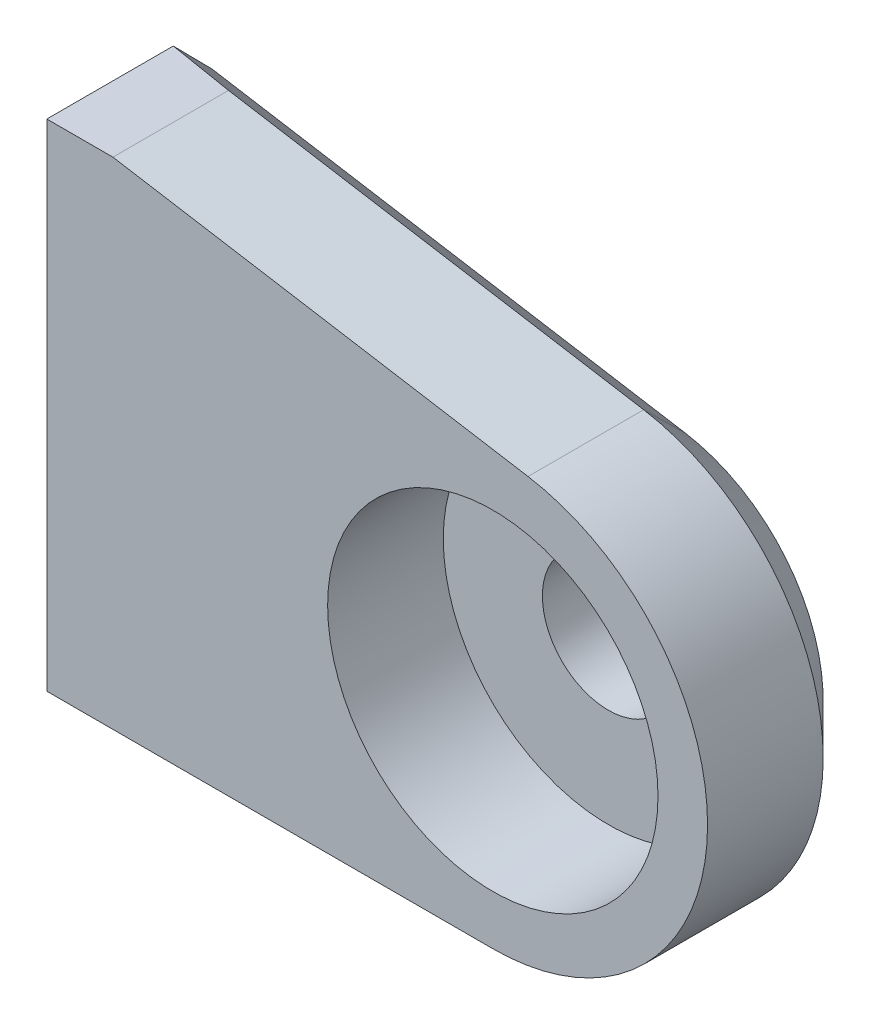
ISO-10303-21;
HEADER;
FILE_DESCRIPTION(('STEP AP214'),'2;1');
FILE_NAME('part.step','',(''),(''),'','','');
FILE_SCHEMA(('AUTOMOTIVE_DESIGN { 1 0 10303 214 1 1 1 1 }'));
ENDSEC;
DATA;
#1=APPLICATION_CONTEXT('core data for automotive mechanical design processes');
#2=APPLICATION_PROTOCOL_DEFINITION('international standard','automotive_design',2000,#1);
#3=PRODUCT_CONTEXT('',#1,'mechanical');
#4=PRODUCT('Part','Part','',(#3));
#5=PRODUCT_RELATED_PRODUCT_CATEGORY('part','',(#4));
#6=PRODUCT_DEFINITION_FORMATION('','',#4);
#7=PRODUCT_DEFINITION_CONTEXT('part definition',#1,'design');
#8=PRODUCT_DEFINITION('design','',#6,#7);
#9=PRODUCT_DEFINITION_SHAPE('','',#8);
#10=(LENGTH_UNIT() NAMED_UNIT(*) SI_UNIT(.MILLI.,.METRE.));
#11=(NAMED_UNIT(*) PLANE_ANGLE_UNIT() SI_UNIT($,.RADIAN.));
#12=(NAMED_UNIT(*) SI_UNIT($,.STERADIAN.) SOLID_ANGLE_UNIT());
#13=UNCERTAINTY_MEASURE_WITH_UNIT(LENGTH_MEASURE(1.E-05),#10,'distance_accuracy_value','');
#14=(GEOMETRIC_REPRESENTATION_CONTEXT(3) GLOBAL_UNCERTAINTY_ASSIGNED_CONTEXT((#13)) GLOBAL_UNIT_ASSIGNED_CONTEXT((#10,
#11,#12)) REPRESENTATION_CONTEXT('',''));
#15=CARTESIAN_POINT('',(0.,0.,0.));
#16=DIRECTION('',(0.,0.,1.));
#17=DIRECTION('',(1.,0.,0.));
#18=AXIS2_PLACEMENT_3D('',#15,#16,#17);
#19=CARTESIAN_POINT('',(0.,0.,5.));
#20=DIRECTION('',(0.,0.,-1.));
#21=DIRECTION('',(-1.,0.,0.));
#22=AXIS2_PLACEMENT_3D('',#19,#20,#21);
#23=CYLINDRICAL_SURFACE('',#22,2.);
#24=CARTESIAN_POINT('',(0.,0.,0.));
#25=DIRECTION('',(0.,0.,1.));
#26=DIRECTION('',(1.,0.,0.));
#27=AXIS2_PLACEMENT_3D('',#24,#25,#26);
#28=CIRCLE('',#27,2.);
#29=CARTESIAN_POINT('',(2.,0.,0.));
#30=VERTEX_POINT('',#29);
#31=EDGE_CURVE('E128',#30,#30,#28,.T.);
#32=ORIENTED_EDGE('',*,*,#31,.F.);
#33=EDGE_LOOP('',(#32));
#34=FACE_BOUND('',#33,.T.);
#35=CARTESIAN_POINT('',(0.,0.,1.5));
#36=DIRECTION('',(0.,0.,1.));
#37=DIRECTION('',(1.,0.,0.));
#38=AXIS2_PLACEMENT_3D('',#35,#36,#37);
#39=CIRCLE('',#38,2.);
#40=CARTESIAN_POINT('',(2.,0.,1.5));
#41=VERTEX_POINT('',#40);
#42=EDGE_CURVE('E126',#41,#41,#39,.T.);
#43=ORIENTED_EDGE('',*,*,#42,.T.);
#44=EDGE_LOOP('',(#43));
#45=FACE_BOUND('',#44,.T.);
#46=ADVANCED_FACE('F33',(#34,#45),#23,.F.);
#47=CARTESIAN_POINT('',(0.,0.,5.));
#48=DIRECTION('',(0.,0.,1.));
#49=DIRECTION('',(1.,0.,0.));
#50=AXIS2_PLACEMENT_3D('',#47,#48,#49);
#51=PLANE('',#50);
#52=CARTESIAN_POINT('',(0.,0.,5.));
#53=DIRECTION('',(0.,0.,1.));
#54=DIRECTION('',(1.,0.,0.));
#55=AXIS2_PLACEMENT_3D('',#52,#53,#54);
#56=CIRCLE('',#55,5.);
#57=CARTESIAN_POINT('',(5.,0.,5.));
#58=VERTEX_POINT('',#57);
#59=EDGE_CURVE('E161',#58,#58,#56,.T.);
#60=ORIENTED_EDGE('',*,*,#59,.F.);
#61=EDGE_LOOP('',(#60));
#62=FACE_BOUND('',#61,.T.);
#63=CARTESIAN_POINT('',(0.,0.,5.));
#64=DIRECTION('',(0.,0.,1.));
#65=DIRECTION('',(1.,0.,0.));
#66=AXIS2_PLACEMENT_3D('',#63,#64,#65);
#67=CIRCLE('',#66,6.5);
#68=CARTESIAN_POINT('',(0.,-6.5,5.));
#69=VERTEX_POINT('',#68);
#70=CARTESIAN_POINT('',(1.06545276752004,6.41208315605653,5.));
#71=VERTEX_POINT('',#70);
#72=EDGE_CURVE('E107',#69,#71,#67,.T.);
#73=ORIENTED_EDGE('',*,*,#72,.T.);
#74=DIRECTION('',(-0.986474331701005,0.163915810387699,0.));
#75=VECTOR('',#74,1.);
#76=CARTESIAN_POINT('',(-11.5,8.5,5.));
#77=LINE('',#76,#75);
#78=CARTESIAN_POINT('',(-11.5,8.5,5.));
#79=VERTEX_POINT('',#78);
#80=EDGE_CURVE('E95',#71,#79,#77,.T.);
#81=ORIENTED_EDGE('',*,*,#80,.T.);
#82=DIRECTION('',(-1.,0.,0.));
#83=VECTOR('',#82,1.);
#84=CARTESIAN_POINT('',(-13.5,8.5,5.));
#85=LINE('',#84,#83);
#86=CARTESIAN_POINT('',(-13.5,8.5,5.));
#87=VERTEX_POINT('',#86);
#88=EDGE_CURVE('E106',#79,#87,#85,.T.);
#89=ORIENTED_EDGE('',*,*,#88,.T.);
#90=DIRECTION('',(0.,-1.,0.));
#91=VECTOR('',#90,1.);
#92=CARTESIAN_POINT('',(-13.5,-6.5,5.));
#93=LINE('',#92,#91);
#94=CARTESIAN_POINT('',(-13.5,-6.5,5.));
#95=VERTEX_POINT('',#94);
#96=EDGE_CURVE('E171',#87,#95,#93,.T.);
#97=ORIENTED_EDGE('',*,*,#96,.T.);
#98=DIRECTION('',(1.,0.,0.));
#99=VECTOR('',#98,1.);
#100=CARTESIAN_POINT('',(0.,-6.5,5.));
#101=LINE('',#100,#99);
#102=EDGE_CURVE('E112',#95,#69,#101,.T.);
#103=ORIENTED_EDGE('',*,*,#102,.T.);
#104=EDGE_LOOP('',(#73,#81,#89,#97,#103));
#105=FACE_BOUND('',#104,.T.);
#106=ADVANCED_FACE('F110',(#62,#105),#51,.T.);
#107=CARTESIAN_POINT('',(0.,0.,0.));
#108=DIRECTION('',(0.,0.,1.));
#109=DIRECTION('',(1.,0.,0.));
#110=AXIS2_PLACEMENT_3D('',#107,#108,#109);
#111=PLANE('',#110);
#112=DIRECTION('',(0.,-1.,0.));
#113=VECTOR('',#112,1.);
#114=CARTESIAN_POINT('',(-13.5,-6.5,0.));
#115=LINE('',#114,#113);
#116=CARTESIAN_POINT('',(-13.5,7.31175987903972,0.));
#117=VERTEX_POINT('',#116);
#118=CARTESIAN_POINT('',(-13.5,-5.,0.));
#119=VERTEX_POINT('',#118);
#120=EDGE_CURVE('E114',#117,#119,#115,.T.);
#121=ORIENTED_EDGE('',*,*,#120,.F.);
#122=DIRECTION('',(0.986474331701005,-0.163915810387699,0.));
#123=VECTOR('',#122,1.);
#124=CARTESIAN_POINT('',(0.819579051938495,4.93237165850501,0.));
#125=LINE('',#124,#123);
#126=CARTESIAN_POINT('',(0.819579051938494,4.93237165850502,0.));
#127=VERTEX_POINT('',#126);
#128=EDGE_CURVE('E56',#117,#127,#125,.T.);
#129=ORIENTED_EDGE('',*,*,#128,.T.);
#130=CARTESIAN_POINT('',(0.,0.,0.));
#131=DIRECTION('',(0.,0.,1.));
#132=DIRECTION('',(1.,0.,0.));
#133=AXIS2_PLACEMENT_3D('',#130,#131,#132);
#134=CIRCLE('',#133,4.99999999999999);
#135=CARTESIAN_POINT('',(0.,-4.99999999999999,0.));
#136=VERTEX_POINT('',#135);
#137=EDGE_CURVE('E138',#127,#136,#134,.F.);
#138=ORIENTED_EDGE('',*,*,#137,.T.);
#139=DIRECTION('',(-1.,0.,0.));
#140=VECTOR('',#139,1.);
#141=CARTESIAN_POINT('',(0.,-4.99999999999999,0.));
#142=LINE('',#141,#140);
#143=EDGE_CURVE('E136',#136,#119,#142,.T.);
#144=ORIENTED_EDGE('',*,*,#143,.T.);
#145=EDGE_LOOP('',(#121,#129,#138,#144));
#146=FACE_BOUND('',#145,.T.);
#147=ORIENTED_EDGE('',*,*,#31,.T.);
#148=EDGE_LOOP('',(#147));
#149=FACE_BOUND('',#148,.T.);
#150=ADVANCED_FACE('F194',(#146,#149),#111,.F.);
#151=CARTESIAN_POINT('',(0.,0.,5.));
#152=DIRECTION('',(0.,0.,-1.));
#153=DIRECTION('',(-1.,0.,0.));
#154=AXIS2_PLACEMENT_3D('',#151,#152,#153);
#155=CYLINDRICAL_SURFACE('',#154,6.5);
#156=DIRECTION('',(0.,0.,-1.));
#157=VECTOR('',#156,1.);
#158=CARTESIAN_POINT('',(0.,-6.5,5.));
#159=LINE('',#158,#157);
#160=CARTESIAN_POINT('',(0.,-6.5,1.5));
#161=VERTEX_POINT('',#160);
#162=EDGE_CURVE('E174',#69,#161,#159,.T.);
#163=ORIENTED_EDGE('',*,*,#162,.T.);
#164=CARTESIAN_POINT('',(0.,0.,1.5));
#165=DIRECTION('',(0.,0.,1.));
#166=DIRECTION('',(1.,0.,0.));
#167=AXIS2_PLACEMENT_3D('',#164,#165,#166);
#168=CIRCLE('',#167,6.5);
#169=CARTESIAN_POINT('',(1.06545276752004,6.41208315605653,1.5));
#170=VERTEX_POINT('',#169);
#171=EDGE_CURVE('E42',#161,#170,#168,.T.);
#172=ORIENTED_EDGE('',*,*,#171,.T.);
#173=DIRECTION('',(0.,0.,-1.));
#174=VECTOR('',#173,1.);
#175=CARTESIAN_POINT('',(1.06545276752004,6.41208315605653,5.));
#176=LINE('',#175,#174);
#177=EDGE_CURVE('E100',#71,#170,#176,.T.);
#178=ORIENTED_EDGE('',*,*,#177,.F.);
#179=ORIENTED_EDGE('',*,*,#72,.F.);
#180=EDGE_LOOP('',(#163,#172,#178,#179));
#181=FACE_BOUND('',#180,.T.);
#182=ADVANCED_FACE('F116',(#181),#155,.T.);
#183=CARTESIAN_POINT('',(-11.5,8.5,5.));
#184=DIRECTION('',(-0.163915810387699,-0.986474331701005,0.));
#185=DIRECTION('',(0.986474331701005,-0.163915810387699,0.));
#186=AXIS2_PLACEMENT_3D('',#183,#184,#185);
#187=PLANE('',#186);
#188=ORIENTED_EDGE('',*,*,#177,.T.);
#189=DIRECTION('',(-0.986474331701005,0.163915810387699,0.));
#190=VECTOR('',#189,1.);
#191=CARTESIAN_POINT('',(-11.5,8.5,1.5));
#192=LINE('',#191,#190);
#193=CARTESIAN_POINT('',(-11.5,8.5,1.5));
#194=VERTEX_POINT('',#193);
#195=EDGE_CURVE('E118',#170,#194,#192,.T.);
#196=ORIENTED_EDGE('',*,*,#195,.T.);
#197=DIRECTION('',(0.,0.,-1.));
#198=VECTOR('',#197,1.);
#199=CARTESIAN_POINT('',(-11.5,8.5,5.));
#200=LINE('',#199,#198);
#201=EDGE_CURVE('E103',#79,#194,#200,.T.);
#202=ORIENTED_EDGE('',*,*,#201,.F.);
#203=ORIENTED_EDGE('',*,*,#80,.F.);
#204=EDGE_LOOP('',(#188,#196,#202,#203));
#205=FACE_BOUND('',#204,.T.);
#206=ADVANCED_FACE('F97',(#205),#187,.F.);
#207=CARTESIAN_POINT('',(-13.5,8.5,5.));
#208=DIRECTION('',(0.,-1.,0.));
#209=DIRECTION('',(0.,0.,-1.));
#210=AXIS2_PLACEMENT_3D('',#207,#208,#209);
#211=PLANE('',#210);
#212=ORIENTED_EDGE('',*,*,#201,.T.);
#213=DIRECTION('',(0.986830597713906,0.,0.161757137139652));
#214=VECTOR('',#213,1.);
#215=CARTESIAN_POINT('',(-11.5,8.5,1.5));
#216=LINE('',#215,#214);
#217=CARTESIAN_POINT('',(-13.5,8.5,1.1721683792246));
#218=VERTEX_POINT('',#217);
#219=EDGE_CURVE('E120',#194,#218,#216,.F.);
#220=ORIENTED_EDGE('',*,*,#219,.T.);
#221=DIRECTION('',(0.,0.,-1.));
#222=VECTOR('',#221,1.);
#223=CARTESIAN_POINT('',(-13.5,8.5,5.));
#224=LINE('',#223,#222);
#225=EDGE_CURVE('E122',#87,#218,#224,.T.);
#226=ORIENTED_EDGE('',*,*,#225,.F.);
#227=ORIENTED_EDGE('',*,*,#88,.F.);
#228=EDGE_LOOP('',(#212,#220,#226,#227));
#229=FACE_BOUND('',#228,.T.);
#230=ADVANCED_FACE('F188',(#229),#211,.F.);
#231=CARTESIAN_POINT('',(-13.5,-6.5,5.));
#232=DIRECTION('',(1.,0.,0.));
#233=DIRECTION('',(0.,1.,0.));
#234=AXIS2_PLACEMENT_3D('',#231,#232,#233);
#235=PLANE('',#234);
#236=CARTESIAN_POINT('',(-13.5,-4.,2.5));
#237=DIRECTION('',(-1.,0.,0.));
#238=DIRECTION('',(0.,1.,0.));
#239=AXIS2_PLACEMENT_3D('',#236,#237,#238);
#240=CIRCLE('',#239,1.);
#241=CARTESIAN_POINT('',(-13.5,-3.,2.5));
#242=VERTEX_POINT('',#241);
#243=EDGE_CURVE('E146',#242,#242,#240,.T.);
#244=ORIENTED_EDGE('',*,*,#243,.F.);
#245=EDGE_LOOP('',(#244));
#246=FACE_BOUND('',#245,.T.);
#247=CARTESIAN_POINT('',(-13.5,6.,2.5));
#248=DIRECTION('',(-1.,0.,0.));
#249=DIRECTION('',(0.,-1.,0.));
#250=AXIS2_PLACEMENT_3D('',#247,#248,#249);
#251=CIRCLE('',#250,1.);
#252=CARTESIAN_POINT('',(-13.5,5.,2.5));
#253=VERTEX_POINT('',#252);
#254=EDGE_CURVE('E155',#253,#253,#251,.T.);
#255=ORIENTED_EDGE('',*,*,#254,.F.);
#256=EDGE_LOOP('',(#255));
#257=FACE_BOUND('',#256,.T.);
#258=ORIENTED_EDGE('',*,*,#225,.T.);
#259=DIRECTION('',(0.,0.711904885384779,0.702275896044627));
#260=VECTOR('',#259,1.);
#261=CARTESIAN_POINT('',(-13.5,8.66390061253408,1.33385212643955));
#262=LINE('',#261,#260);
#263=EDGE_CURVE('E134',#218,#117,#262,.F.);
#264=ORIENTED_EDGE('',*,*,#263,.T.);
#265=ORIENTED_EDGE('',*,*,#120,.T.);
#266=DIRECTION('',(0.,0.707106781186549,-0.707106781186546));
#267=VECTOR('',#266,1.);
#268=CARTESIAN_POINT('',(-13.5,-6.5,1.5));
#269=LINE('',#268,#267);
#270=CARTESIAN_POINT('',(-13.5,-6.5,1.5));
#271=VERTEX_POINT('',#270);
#272=EDGE_CURVE('E132',#119,#271,#269,.F.);
#273=ORIENTED_EDGE('',*,*,#272,.T.);
#274=DIRECTION('',(0.,0.,-1.));
#275=VECTOR('',#274,1.);
#276=CARTESIAN_POINT('',(-13.5,-6.5,5.));
#277=LINE('',#276,#275);
#278=EDGE_CURVE('E178',#95,#271,#277,.T.);
#279=ORIENTED_EDGE('',*,*,#278,.F.);
#280=ORIENTED_EDGE('',*,*,#96,.F.);
#281=EDGE_LOOP('',(#258,#264,#265,#273,#279,#280));
#282=FACE_BOUND('',#281,.T.);
#283=ADVANCED_FACE('F184',(#246,#257,#282),#235,.F.);
#284=CARTESIAN_POINT('',(0.,-6.5,5.));
#285=DIRECTION('',(0.,1.,0.));
#286=DIRECTION('',(-1.,0.,0.));
#287=AXIS2_PLACEMENT_3D('',#284,#285,#286);
#288=PLANE('',#287);
#289=ORIENTED_EDGE('',*,*,#278,.T.);
#290=DIRECTION('',(1.,0.,0.));
#291=VECTOR('',#290,1.);
#292=CARTESIAN_POINT('',(0.,-6.5,1.5));
#293=LINE('',#292,#291);
#294=EDGE_CURVE('E11',#271,#161,#293,.T.);
#295=ORIENTED_EDGE('',*,*,#294,.T.);
#296=ORIENTED_EDGE('',*,*,#162,.F.);
#297=ORIENTED_EDGE('',*,*,#102,.F.);
#298=EDGE_LOOP('',(#289,#295,#296,#297));
#299=FACE_BOUND('',#298,.T.);
#300=ADVANCED_FACE('F190',(#299),#288,.F.);
#301=CARTESIAN_POINT('',(0.,0.,1.5));
#302=DIRECTION('',(0.,0.,1.));
#303=DIRECTION('',(1.,0.,0.));
#304=AXIS2_PLACEMENT_3D('',#301,#302,#303);
#305=CYLINDRICAL_SURFACE('',#304,5.);
#306=CARTESIAN_POINT('',(0.,0.,1.5));
#307=DIRECTION('',(0.,0.,1.));
#308=DIRECTION('',(1.,0.,0.));
#309=AXIS2_PLACEMENT_3D('',#306,#307,#308);
#310=CIRCLE('',#309,5.);
#311=CARTESIAN_POINT('',(5.,0.,1.5));
#312=VERTEX_POINT('',#311);
#313=EDGE_CURVE('E129',#312,#312,#310,.T.);
#314=ORIENTED_EDGE('',*,*,#313,.F.);
#315=EDGE_LOOP('',(#314));
#316=FACE_BOUND('',#315,.T.);
#317=ORIENTED_EDGE('',*,*,#59,.T.);
#318=EDGE_LOOP('',(#317));
#319=FACE_BOUND('',#318,.T.);
#320=ADVANCED_FACE('F209',(#316,#319),#305,.F.);
#321=CARTESIAN_POINT('',(0.,0.,1.5));
#322=DIRECTION('',(0.,0.,1.));
#323=DIRECTION('',(1.,0.,0.));
#324=AXIS2_PLACEMENT_3D('',#321,#322,#323);
#325=PLANE('',#324);
#326=ORIENTED_EDGE('',*,*,#42,.F.);
#327=EDGE_LOOP('',(#326));
#328=FACE_BOUND('',#327,.T.);
#329=ORIENTED_EDGE('',*,*,#313,.T.);
#330=EDGE_LOOP('',(#329));
#331=FACE_BOUND('',#330,.T.);
#332=ADVANCED_FACE('F205',(#328,#331),#325,.T.);
#333=CARTESIAN_POINT('',(-11.5,6.,2.5));
#334=DIRECTION('',(-1.,0.,0.));
#335=DIRECTION('',(0.,-1.,0.));
#336=AXIS2_PLACEMENT_3D('',#333,#334,#335);
#337=CYLINDRICAL_SURFACE('',#336,1.);
#338=CARTESIAN_POINT('',(-11.5,6.,2.5));
#339=DIRECTION('',(-1.,0.,0.));
#340=DIRECTION('',(0.,-1.,0.));
#341=AXIS2_PLACEMENT_3D('',#338,#339,#340);
#342=CIRCLE('',#341,1.);
#343=CARTESIAN_POINT('',(-11.5,5.,2.5));
#344=VERTEX_POINT('',#343);
#345=EDGE_CURVE('E158',#344,#344,#342,.T.);
#346=ORIENTED_EDGE('',*,*,#345,.F.);
#347=EDGE_LOOP('',(#346));
#348=FACE_BOUND('',#347,.T.);
#349=ORIENTED_EDGE('',*,*,#254,.T.);
#350=EDGE_LOOP('',(#349));
#351=FACE_BOUND('',#350,.T.);
#352=ADVANCED_FACE('F208',(#348,#351),#337,.F.);
#353=CARTESIAN_POINT('',(-11.5,6.,2.5));
#354=DIRECTION('',(-1.,0.,0.));
#355=DIRECTION('',(0.,-1.,0.));
#356=AXIS2_PLACEMENT_3D('',#353,#354,#355);
#357=PLANE('',#356);
#358=ORIENTED_EDGE('',*,*,#345,.T.);
#359=EDGE_LOOP('',(#358));
#360=FACE_BOUND('',#359,.T.);
#361=ADVANCED_FACE('F249',(#360),#357,.T.);
#362=CARTESIAN_POINT('',(-11.5,-4.,2.5));
#363=DIRECTION('',(-1.,0.,0.));
#364=DIRECTION('',(0.,-1.,0.));
#365=AXIS2_PLACEMENT_3D('',#362,#363,#364);
#366=CYLINDRICAL_SURFACE('',#365,1.);
#367=CARTESIAN_POINT('',(-11.5,-4.,2.5));
#368=DIRECTION('',(-1.,0.,0.));
#369=DIRECTION('',(0.,1.,0.));
#370=AXIS2_PLACEMENT_3D('',#367,#368,#369);
#371=CIRCLE('',#370,1.);
#372=CARTESIAN_POINT('',(-11.5,-3.,2.5));
#373=VERTEX_POINT('',#372);
#374=EDGE_CURVE('E150',#373,#373,#371,.T.);
#375=ORIENTED_EDGE('',*,*,#374,.F.);
#376=EDGE_LOOP('',(#375));
#377=FACE_BOUND('',#376,.T.);
#378=ORIENTED_EDGE('',*,*,#243,.T.);
#379=EDGE_LOOP('',(#378));
#380=FACE_BOUND('',#379,.T.);
#381=ADVANCED_FACE('F243',(#377,#380),#366,.F.);
#382=CARTESIAN_POINT('',(-11.5,-4.,2.5));
#383=DIRECTION('',(1.,0.,0.));
#384=DIRECTION('',(0.,1.,0.));
#385=AXIS2_PLACEMENT_3D('',#382,#383,#384);
#386=PLANE('',#385);
#387=ORIENTED_EDGE('',*,*,#374,.T.);
#388=EDGE_LOOP('',(#387));
#389=FACE_BOUND('',#388,.T.);
#390=ADVANCED_FACE('F239',(#389),#386,.F.);
#391=CARTESIAN_POINT('',(0.,-6.5,1.5));
#392=DIRECTION('',(0.,0.707106781186546,0.707106781186549));
#393=DIRECTION('',(0.,-0.707106781186549,0.707106781186546));
#394=AXIS2_PLACEMENT_3D('',#391,#392,#393);
#395=PLANE('',#394);
#396=ORIENTED_EDGE('',*,*,#272,.F.);
#397=ORIENTED_EDGE('',*,*,#143,.F.);
#398=DIRECTION('',(0.,0.707106781186549,-0.707106781186546));
#399=VECTOR('',#398,1.);
#400=CARTESIAN_POINT('',(0.,-6.5,1.5));
#401=LINE('',#400,#399);
#402=EDGE_CURVE('E37',#161,#136,#401,.T.);
#403=ORIENTED_EDGE('',*,*,#402,.F.);
#404=ORIENTED_EDGE('',*,*,#294,.F.);
#405=EDGE_LOOP('',(#396,#397,#403,#404));
#406=FACE_BOUND('',#405,.T.);
#407=ADVANCED_FACE('F35',(#406),#395,.F.);
#408=CARTESIAN_POINT('',(0.,0.,1.5));
#409=DIRECTION('',(0.,0.,1.));
#410=DIRECTION('',(1.,0.,0.));
#411=AXIS2_PLACEMENT_3D('',#408,#409,#410);
#412=CONICAL_SURFACE('',#411,6.5,0.785398163397451);
#413=ORIENTED_EDGE('',*,*,#402,.T.);
#414=ORIENTED_EDGE('',*,*,#137,.F.);
#415=DIRECTION('',(-0.115905981068831,-0.69754268941225,-0.707106781186546));
#416=VECTOR('',#415,1.);
#417=CARTESIAN_POINT('',(1.06545276752004,6.41208315605653,1.5));
#418=LINE('',#417,#416);
#419=EDGE_CURVE('E141',#170,#127,#418,.T.);
#420=ORIENTED_EDGE('',*,*,#419,.F.);
#421=ORIENTED_EDGE('',*,*,#171,.F.);
#422=EDGE_LOOP('',(#413,#414,#420,#421));
#423=FACE_BOUND('',#422,.T.);
#424=ADVANCED_FACE('F193',(#423),#412,.T.);
#425=CARTESIAN_POINT('',(-11.5,8.5,1.5));
#426=DIRECTION('',(-0.11590598106883,-0.697542689412246,0.707106781186549));
#427=DIRECTION('',(0.,-0.711904885384779,-0.702275896044627));
#428=AXIS2_PLACEMENT_3D('',#425,#426,#427);
#429=PLANE('',#428);
#430=ORIENTED_EDGE('',*,*,#419,.T.);
#431=ORIENTED_EDGE('',*,*,#128,.F.);
#432=ORIENTED_EDGE('',*,*,#263,.F.);
#433=ORIENTED_EDGE('',*,*,#219,.F.);
#434=ORIENTED_EDGE('',*,*,#195,.F.);
#435=EDGE_LOOP('',(#430,#431,#432,#433,#434));
#436=FACE_BOUND('',#435,.T.);
#437=ADVANCED_FACE('F187',(#436),#429,.F.);
#438=CLOSED_SHELL('',(#46,#106,#150,#182,#206,#230,#283,#300,#320,#332,#352,#361,#381,#390,#407,
#424,#437));
#439=MANIFOLD_SOLID_BREP('B2',#438);
#440=ADVANCED_BREP_SHAPE_REPRESENTATION('',(#18,#439),#14);
#441=SHAPE_DEFINITION_REPRESENTATION(#9,#440);
ENDSEC;
END-ISO-10303-21;
